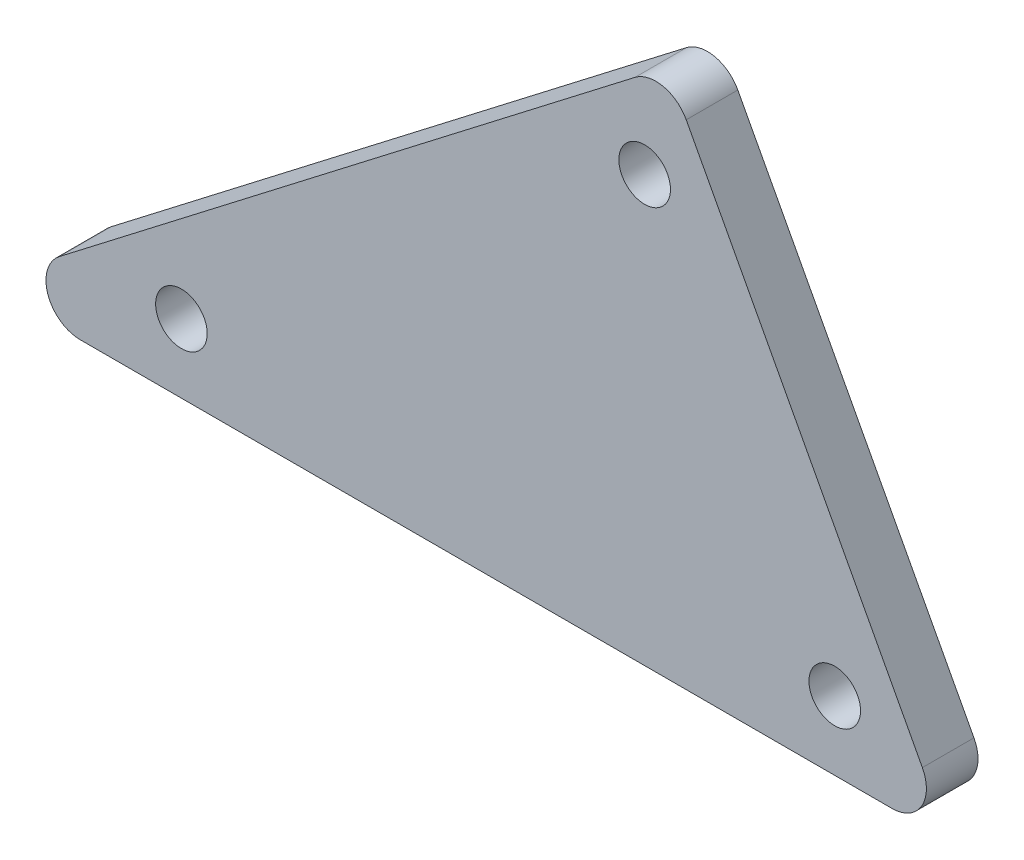
ISO-10303-21;
HEADER;
FILE_DESCRIPTION(('STEP AP214'),'2;1');
FILE_NAME('part.step','',(''),(''),'','','');
FILE_SCHEMA(('AUTOMOTIVE_DESIGN { 1 0 10303 214 1 1 1 1 }'));
ENDSEC;
DATA;
#1=APPLICATION_CONTEXT('core data for automotive mechanical design processes');
#2=APPLICATION_PROTOCOL_DEFINITION('international standard','automotive_design',2000,#1);
#3=PRODUCT_CONTEXT('',#1,'mechanical');
#4=PRODUCT('Part','Part','',(#3));
#5=PRODUCT_RELATED_PRODUCT_CATEGORY('part','',(#4));
#6=PRODUCT_DEFINITION_FORMATION('','',#4);
#7=PRODUCT_DEFINITION_CONTEXT('part definition',#1,'design');
#8=PRODUCT_DEFINITION('design','',#6,#7);
#9=PRODUCT_DEFINITION_SHAPE('','',#8);
#10=(LENGTH_UNIT() NAMED_UNIT(*) SI_UNIT(.MILLI.,.METRE.));
#11=(NAMED_UNIT(*) PLANE_ANGLE_UNIT() SI_UNIT($,.RADIAN.));
#12=(NAMED_UNIT(*) SI_UNIT($,.STERADIAN.) SOLID_ANGLE_UNIT());
#13=UNCERTAINTY_MEASURE_WITH_UNIT(LENGTH_MEASURE(1.E-05),#10,'distance_accuracy_value','');
#14=(GEOMETRIC_REPRESENTATION_CONTEXT(3) GLOBAL_UNCERTAINTY_ASSIGNED_CONTEXT((#13)) GLOBAL_UNIT_ASSIGNED_CONTEXT((#10,
#11,#12)) REPRESENTATION_CONTEXT('',''));
#15=CARTESIAN_POINT('',(0.,0.,0.));
#16=DIRECTION('',(0.,0.,1.));
#17=DIRECTION('',(1.,0.,0.));
#18=AXIS2_PLACEMENT_3D('',#15,#16,#17);
#19=CARTESIAN_POINT('',(0.,-4.,3.));
#20=DIRECTION('',(0.,-1.,0.));
#21=DIRECTION('',(0.,0.,-1.));
#22=AXIS2_PLACEMENT_3D('',#19,#20,#21);
#23=PLANE('',#22);
#24=DIRECTION('',(-1.,0.,0.));
#25=VECTOR('',#24,1.);
#26=CARTESIAN_POINT('',(0.,-4.,3.));
#27=LINE('',#26,#25);
#28=CARTESIAN_POINT('',(3.3328046104601,-4.,3.));
#29=VERTEX_POINT('',#28);
#30=CARTESIAN_POINT('',(-43.8778554039024,-4.,3.));
#31=VERTEX_POINT('',#30);
#32=EDGE_CURVE('E132',#29,#31,#27,.T.);
#33=ORIENTED_EDGE('',*,*,#32,.T.);
#34=DIRECTION('',(0.,0.,-1.));
#35=VECTOR('',#34,1.);
#36=CARTESIAN_POINT('',(-43.8778554039024,-4.,3.));
#37=LINE('',#36,#35);
#38=CARTESIAN_POINT('',(-43.8778554039024,-4.,0.));
#39=VERTEX_POINT('',#38);
#40=EDGE_CURVE('E104',#31,#39,#37,.T.);
#41=ORIENTED_EDGE('',*,*,#40,.T.);
#42=DIRECTION('',(-1.,0.,0.));
#43=VECTOR('',#42,1.);
#44=CARTESIAN_POINT('',(0.,-4.,0.));
#45=LINE('',#44,#43);
#46=CARTESIAN_POINT('',(3.3328046104601,-4.,0.));
#47=VERTEX_POINT('',#46);
#48=EDGE_CURVE('E91',#47,#39,#45,.T.);
#49=ORIENTED_EDGE('',*,*,#48,.F.);
#50=DIRECTION('',(0.,0.,-1.));
#51=VECTOR('',#50,1.);
#52=CARTESIAN_POINT('',(3.3328046104601,-4.,3.));
#53=LINE('',#52,#51);
#54=EDGE_CURVE('E102',#47,#29,#53,.F.);
#55=ORIENTED_EDGE('',*,*,#54,.T.);
#56=EDGE_LOOP('',(#33,#41,#49,#55));
#57=FACE_BOUND('',#56,.T.);
#58=ADVANCED_FACE('F34',(#57),#23,.T.);
#59=CARTESIAN_POINT('',(3.52967520755055,1.88185890257559,3.));
#60=DIRECTION('',(0.882418801887637,0.470464725643897,0.));
#61=DIRECTION('',(-0.470464725643897,0.882418801887637,0.));
#62=AXIS2_PLACEMENT_3D('',#59,#60,#61);
#63=PLANE('',#62);
#64=DIRECTION('',(0.470464725643897,-0.882418801887637,0.));
#65=VECTOR('',#64,1.);
#66=CARTESIAN_POINT('',(3.52967520755055,1.88185890257559,3.));
#67=LINE('',#66,#65);
#68=CARTESIAN_POINT('',(-8.63807699527572,24.7040870851209,3.));
#69=VERTEX_POINT('',#68);
#70=CARTESIAN_POINT('',(5.09764221423537,-1.05907054871221,3.));
#71=VERTEX_POINT('',#70);
#72=EDGE_CURVE('E112',#69,#71,#67,.T.);
#73=ORIENTED_EDGE('',*,*,#72,.T.);
#74=DIRECTION('',(0.,0.,-1.));
#75=VECTOR('',#74,1.);
#76=CARTESIAN_POINT('',(5.09764221423537,-1.05907054871221,3.));
#77=LINE('',#76,#75);
#78=CARTESIAN_POINT('',(5.09764221423537,-1.05907054871221,0.));
#79=VERTEX_POINT('',#78);
#80=EDGE_CURVE('E11',#71,#79,#77,.T.);
#81=ORIENTED_EDGE('',*,*,#80,.T.);
#82=DIRECTION('',(0.470464725643897,-0.882418801887637,0.));
#83=VECTOR('',#82,1.);
#84=CARTESIAN_POINT('',(3.52967520755055,1.88185890257559,0.));
#85=LINE('',#84,#83);
#86=CARTESIAN_POINT('',(-8.63807699527572,24.7040870851209,0.));
#87=VERTEX_POINT('',#86);
#88=EDGE_CURVE('E92',#87,#79,#85,.T.);
#89=ORIENTED_EDGE('',*,*,#88,.F.);
#90=DIRECTION('',(0.,0.,-1.));
#91=VECTOR('',#90,1.);
#92=CARTESIAN_POINT('',(-8.63807699527572,24.7040870851209,3.));
#93=LINE('',#92,#91);
#94=EDGE_CURVE('E42',#87,#69,#93,.F.);
#95=ORIENTED_EDGE('',*,*,#94,.T.);
#96=EDGE_LOOP('',(#73,#81,#89,#95));
#97=FACE_BOUND('',#96,.T.);
#98=ADVANCED_FACE('F174',(#97),#63,.T.);
#99=CARTESIAN_POINT('',(0.,0.,3.));
#100=DIRECTION('',(0.,0.,-1.));
#101=DIRECTION('',(-1.,0.,0.));
#102=AXIS2_PLACEMENT_3D('',#99,#100,#101);
#103=CYLINDRICAL_SURFACE('',#102,1.5);
#104=CARTESIAN_POINT('',(0.,0.,3.));
#105=DIRECTION('',(0.,0.,1.));
#106=DIRECTION('',(1.,0.,0.));
#107=AXIS2_PLACEMENT_3D('',#104,#105,#106);
#108=CIRCLE('',#107,1.5);
#109=CARTESIAN_POINT('',(1.5,0.,3.));
#110=VERTEX_POINT('',#109);
#111=EDGE_CURVE('E135',#110,#110,#108,.T.);
#112=ORIENTED_EDGE('',*,*,#111,.T.);
#113=EDGE_LOOP('',(#112));
#114=FACE_BOUND('',#113,.T.);
#115=CARTESIAN_POINT('',(0.,0.,0.));
#116=DIRECTION('',(0.,0.,1.));
#117=DIRECTION('',(1.,0.,0.));
#118=AXIS2_PLACEMENT_3D('',#115,#116,#117);
#119=CIRCLE('',#118,1.5);
#120=CARTESIAN_POINT('',(1.5,0.,0.));
#121=VERTEX_POINT('',#120);
#122=EDGE_CURVE('E105',#121,#121,#119,.T.);
#123=ORIENTED_EDGE('',*,*,#122,.F.);
#124=EDGE_LOOP('',(#123));
#125=FACE_BOUND('',#124,.T.);
#126=ADVANCED_FACE('F171',(#114,#125),#103,.F.);
#127=CARTESIAN_POINT('',(-11.0559210526316,20.7368418443595,3.));
#128=DIRECTION('',(0.,0.,-1.));
#129=DIRECTION('',(-1.,0.,0.));
#130=AXIS2_PLACEMENT_3D('',#127,#128,#129);
#131=CYLINDRICAL_SURFACE('',#130,1.5);
#132=CARTESIAN_POINT('',(-11.0559210526316,20.7368418443595,3.));
#133=DIRECTION('',(0.,0.,1.));
#134=DIRECTION('',(1.,0.,0.));
#135=AXIS2_PLACEMENT_3D('',#132,#133,#134);
#136=CIRCLE('',#135,1.5);
#137=CARTESIAN_POINT('',(-9.55592105263158,20.7368418443595,3.));
#138=VERTEX_POINT('',#137);
#139=EDGE_CURVE('E145',#138,#138,#136,.T.);
#140=ORIENTED_EDGE('',*,*,#139,.T.);
#141=EDGE_LOOP('',(#140));
#142=FACE_BOUND('',#141,.T.);
#143=CARTESIAN_POINT('',(-11.0559210526316,20.7368418443595,0.));
#144=DIRECTION('',(0.,0.,1.));
#145=DIRECTION('',(1.,0.,0.));
#146=AXIS2_PLACEMENT_3D('',#143,#144,#145);
#147=CIRCLE('',#146,1.5);
#148=CARTESIAN_POINT('',(-9.55592105263158,20.7368418443595,0.));
#149=VERTEX_POINT('',#148);
#150=EDGE_CURVE('E150',#149,#149,#147,.T.);
#151=ORIENTED_EDGE('',*,*,#150,.F.);
#152=EDGE_LOOP('',(#151));
#153=FACE_BOUND('',#152,.T.);
#154=ADVANCED_FACE('F162',(#142,#153),#131,.F.);
#155=CARTESIAN_POINT('',(-38.,0.,3.));
#156=DIRECTION('',(0.,0.,-1.));
#157=DIRECTION('',(-1.,0.,0.));
#158=AXIS2_PLACEMENT_3D('',#155,#156,#157);
#159=CYLINDRICAL_SURFACE('',#158,1.5);
#160=CARTESIAN_POINT('',(-38.,0.,3.));
#161=DIRECTION('',(0.,0.,1.));
#162=DIRECTION('',(1.,0.,0.));
#163=AXIS2_PLACEMENT_3D('',#160,#161,#162);
#164=CIRCLE('',#163,1.5);
#165=CARTESIAN_POINT('',(-36.5,0.,3.));
#166=VERTEX_POINT('',#165);
#167=EDGE_CURVE('E143',#166,#166,#164,.T.);
#168=ORIENTED_EDGE('',*,*,#167,.T.);
#169=EDGE_LOOP('',(#168));
#170=FACE_BOUND('',#169,.T.);
#171=CARTESIAN_POINT('',(-38.,0.,0.));
#172=DIRECTION('',(0.,0.,1.));
#173=DIRECTION('',(1.,0.,0.));
#174=AXIS2_PLACEMENT_3D('',#171,#172,#173);
#175=CIRCLE('',#174,1.5);
#176=CARTESIAN_POINT('',(-36.5,0.,0.));
#177=VERTEX_POINT('',#176);
#178=EDGE_CURVE('E153',#177,#177,#175,.T.);
#179=ORIENTED_EDGE('',*,*,#178,.F.);
#180=EDGE_LOOP('',(#179));
#181=FACE_BOUND('',#180,.T.);
#182=ADVANCED_FACE('F196',(#170,#181),#159,.F.);
#183=CARTESIAN_POINT('',(-16.5751225420381,21.5366165053942,3.));
#184=DIRECTION('',(-0.609907113069396,0.792472910216718,0.));
#185=DIRECTION('',(-0.792472910216718,-0.609907113069396,0.));
#186=AXIS2_PLACEMENT_3D('',#183,#184,#185);
#187=PLANE('',#186);
#188=DIRECTION('',(0.792472910216718,0.609907113069396,0.));
#189=VECTOR('',#188,1.);
#190=CARTESIAN_POINT('',(-16.5751225420381,21.5366165053942,0.));
#191=LINE('',#190,#189);
#192=CARTESIAN_POINT('',(-45.0976696300411,-0.415054179566561,0.));
#193=VERTEX_POINT('',#192);
#194=CARTESIAN_POINT('',(-11.6227288251898,25.3481034542666,0.));
#195=VERTEX_POINT('',#194);
#196=EDGE_CURVE('E115',#193,#195,#191,.T.);
#197=ORIENTED_EDGE('',*,*,#196,.F.);
#198=DIRECTION('',(0.,0.,-1.));
#199=VECTOR('',#198,1.);
#200=CARTESIAN_POINT('',(-45.0976696300411,-0.415054179566561,3.));
#201=LINE('',#200,#199);
#202=CARTESIAN_POINT('',(-45.0976696300411,-0.415054179566561,3.));
#203=VERTEX_POINT('',#202);
#204=EDGE_CURVE('E123',#193,#203,#201,.F.);
#205=ORIENTED_EDGE('',*,*,#204,.T.);
#206=DIRECTION('',(0.792472910216718,0.609907113069396,0.));
#207=VECTOR('',#206,1.);
#208=CARTESIAN_POINT('',(-16.5751225420381,21.5366165053942,3.));
#209=LINE('',#208,#207);
#210=CARTESIAN_POINT('',(-11.6227288251898,25.3481034542666,3.));
#211=VERTEX_POINT('',#210);
#212=EDGE_CURVE('E108',#203,#211,#209,.T.);
#213=ORIENTED_EDGE('',*,*,#212,.T.);
#214=DIRECTION('',(0.,0.,-1.));
#215=VECTOR('',#214,1.);
#216=CARTESIAN_POINT('',(-11.6227288251898,25.3481034542666,3.));
#217=LINE('',#216,#215);
#218=EDGE_CURVE('E120',#211,#195,#217,.T.);
#219=ORIENTED_EDGE('',*,*,#218,.T.);
#220=EDGE_LOOP('',(#197,#205,#213,#219));
#221=FACE_BOUND('',#220,.T.);
#222=ADVANCED_FACE('F141',(#221),#187,.T.);
#223=CARTESIAN_POINT('',(0.,0.,3.));
#224=DIRECTION('',(0.,0.,1.));
#225=DIRECTION('',(1.,0.,0.));
#226=AXIS2_PLACEMENT_3D('',#223,#224,#225);
#227=PLANE('',#226);
#228=ORIENTED_EDGE('',*,*,#167,.F.);
#229=EDGE_LOOP('',(#228));
#230=FACE_BOUND('',#229,.T.);
#231=ORIENTED_EDGE('',*,*,#139,.F.);
#232=EDGE_LOOP('',(#231));
#233=FACE_BOUND('',#232,.T.);
#234=ORIENTED_EDGE('',*,*,#111,.F.);
#235=EDGE_LOOP('',(#234));
#236=FACE_BOUND('',#235,.T.);
#237=ORIENTED_EDGE('',*,*,#212,.F.);
#238=CARTESIAN_POINT('',(-43.8778554039024,-2.,3.));
#239=DIRECTION('',(0.,0.,1.));
#240=DIRECTION('',(1.,0.,0.));
#241=AXIS2_PLACEMENT_3D('',#238,#239,#240);
#242=CIRCLE('',#241,2.);
#243=EDGE_CURVE('E128',#203,#31,#242,.T.);
#244=ORIENTED_EDGE('',*,*,#243,.T.);
#245=ORIENTED_EDGE('',*,*,#32,.F.);
#246=CARTESIAN_POINT('',(3.3328046104601,-2.,3.));
#247=DIRECTION('',(0.,0.,1.));
#248=DIRECTION('',(1.,0.,0.));
#249=AXIS2_PLACEMENT_3D('',#246,#247,#248);
#250=CIRCLE('',#249,2.);
#251=EDGE_CURVE('E49',#29,#71,#250,.T.);
#252=ORIENTED_EDGE('',*,*,#251,.T.);
#253=ORIENTED_EDGE('',*,*,#72,.F.);
#254=CARTESIAN_POINT('',(-10.402914599051,23.7631576338331,3.));
#255=DIRECTION('',(0.,0.,1.));
#256=DIRECTION('',(1.,0.,0.));
#257=AXIS2_PLACEMENT_3D('',#254,#255,#256);
#258=CIRCLE('',#257,2.);
#259=EDGE_CURVE('E125',#69,#211,#258,.T.);
#260=ORIENTED_EDGE('',*,*,#259,.T.);
#261=EDGE_LOOP('',(#237,#244,#245,#252,#253,#260));
#262=FACE_BOUND('',#261,.T.);
#263=ADVANCED_FACE('F131',(#230,#233,#236,#262),#227,.T.);
#264=CARTESIAN_POINT('',(0.,0.,0.));
#265=DIRECTION('',(0.,0.,1.));
#266=DIRECTION('',(1.,0.,0.));
#267=AXIS2_PLACEMENT_3D('',#264,#265,#266);
#268=PLANE('',#267);
#269=ORIENTED_EDGE('',*,*,#178,.T.);
#270=EDGE_LOOP('',(#269));
#271=FACE_BOUND('',#270,.T.);
#272=ORIENTED_EDGE('',*,*,#150,.T.);
#273=EDGE_LOOP('',(#272));
#274=FACE_BOUND('',#273,.T.);
#275=ORIENTED_EDGE('',*,*,#122,.T.);
#276=EDGE_LOOP('',(#275));
#277=FACE_BOUND('',#276,.T.);
#278=ORIENTED_EDGE('',*,*,#48,.T.);
#279=CARTESIAN_POINT('',(-43.8778554039024,-2.,0.));
#280=DIRECTION('',(0.,0.,1.));
#281=DIRECTION('',(1.,0.,0.));
#282=AXIS2_PLACEMENT_3D('',#279,#280,#281);
#283=CIRCLE('',#282,2.);
#284=EDGE_CURVE('E96',#39,#193,#283,.F.);
#285=ORIENTED_EDGE('',*,*,#284,.T.);
#286=ORIENTED_EDGE('',*,*,#196,.T.);
#287=CARTESIAN_POINT('',(-10.402914599051,23.7631576338331,0.));
#288=DIRECTION('',(0.,0.,1.));
#289=DIRECTION('',(1.,0.,0.));
#290=AXIS2_PLACEMENT_3D('',#287,#288,#289);
#291=CIRCLE('',#290,2.);
#292=EDGE_CURVE('E97',#195,#87,#291,.F.);
#293=ORIENTED_EDGE('',*,*,#292,.T.);
#294=ORIENTED_EDGE('',*,*,#88,.T.);
#295=CARTESIAN_POINT('',(3.3328046104601,-2.,0.));
#296=DIRECTION('',(0.,0.,1.));
#297=DIRECTION('',(1.,0.,0.));
#298=AXIS2_PLACEMENT_3D('',#295,#296,#297);
#299=CIRCLE('',#298,2.);
#300=EDGE_CURVE('E88',#79,#47,#299,.F.);
#301=ORIENTED_EDGE('',*,*,#300,.T.);
#302=EDGE_LOOP('',(#278,#285,#286,#293,#294,#301));
#303=FACE_BOUND('',#302,.T.);
#304=ADVANCED_FACE('F90',(#271,#274,#277,#303),#268,.F.);
#305=CARTESIAN_POINT('',(-43.8778554039024,-2.,3.));
#306=DIRECTION('',(0.,0.,-1.));
#307=DIRECTION('',(-1.,0.,0.));
#308=AXIS2_PLACEMENT_3D('',#305,#306,#307);
#309=CYLINDRICAL_SURFACE('',#308,2.);
#310=ORIENTED_EDGE('',*,*,#243,.F.);
#311=ORIENTED_EDGE('',*,*,#204,.F.);
#312=ORIENTED_EDGE('',*,*,#284,.F.);
#313=ORIENTED_EDGE('',*,*,#40,.F.);
#314=EDGE_LOOP('',(#310,#311,#312,#313));
#315=FACE_BOUND('',#314,.T.);
#316=ADVANCED_FACE('F137',(#315),#309,.T.);
#317=CARTESIAN_POINT('',(3.3328046104601,-2.,3.));
#318=DIRECTION('',(0.,0.,-1.));
#319=DIRECTION('',(-1.,0.,0.));
#320=AXIS2_PLACEMENT_3D('',#317,#318,#319);
#321=CYLINDRICAL_SURFACE('',#320,2.);
#322=ORIENTED_EDGE('',*,*,#251,.F.);
#323=ORIENTED_EDGE('',*,*,#54,.F.);
#324=ORIENTED_EDGE('',*,*,#300,.F.);
#325=ORIENTED_EDGE('',*,*,#80,.F.);
#326=EDGE_LOOP('',(#322,#323,#324,#325));
#327=FACE_BOUND('',#326,.T.);
#328=ADVANCED_FACE('F107',(#327),#321,.T.);
#329=CARTESIAN_POINT('',(-10.402914599051,23.7631576338331,3.));
#330=DIRECTION('',(0.,0.,-1.));
#331=DIRECTION('',(-1.,0.,0.));
#332=AXIS2_PLACEMENT_3D('',#329,#330,#331);
#333=CYLINDRICAL_SURFACE('',#332,2.);
#334=ORIENTED_EDGE('',*,*,#259,.F.);
#335=ORIENTED_EDGE('',*,*,#94,.F.);
#336=ORIENTED_EDGE('',*,*,#292,.F.);
#337=ORIENTED_EDGE('',*,*,#218,.F.);
#338=EDGE_LOOP('',(#334,#335,#336,#337));
#339=FACE_BOUND('',#338,.T.);
#340=ADVANCED_FACE('F36',(#339),#333,.T.);
#341=CLOSED_SHELL('',(#58,#98,#126,#154,#182,#222,#263,#304,#316,#328,#340));
#342=MANIFOLD_SOLID_BREP('B2',#341);
#343=ADVANCED_BREP_SHAPE_REPRESENTATION('',(#18,#342),#14);
#344=SHAPE_DEFINITION_REPRESENTATION(#9,#343);
ENDSEC;
END-ISO-10303-21;
